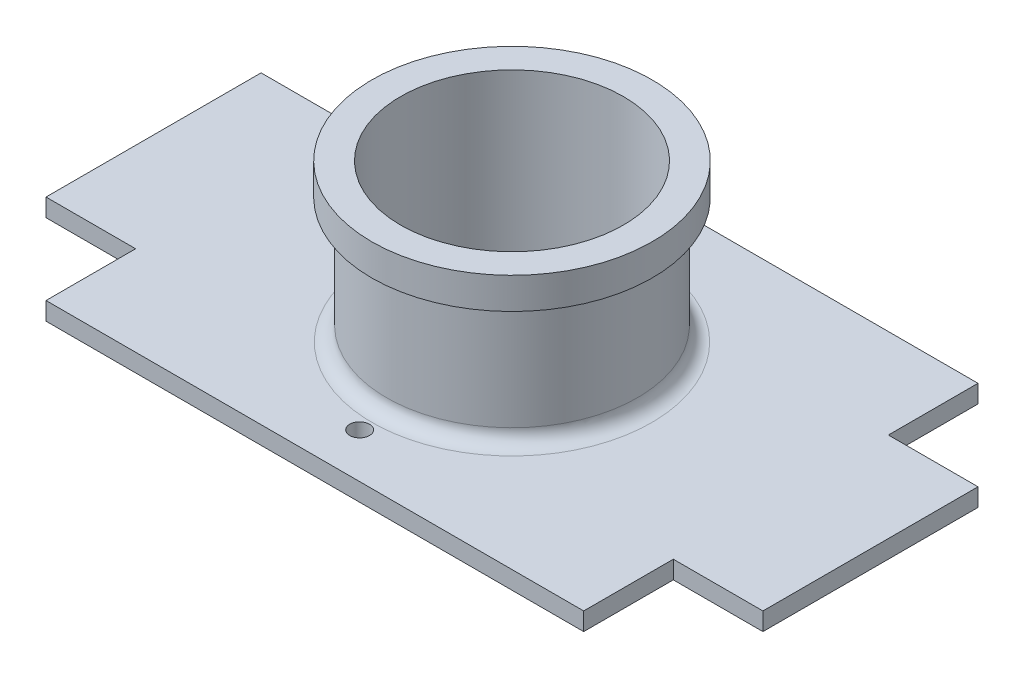
ISO-10303-21;
HEADER;
FILE_DESCRIPTION(('STEP AP214'),'2;1');
FILE_NAME('part.step','',(''),(''),'','','');
FILE_SCHEMA(('AUTOMOTIVE_DESIGN { 1 0 10303 214 1 1 1 1 }'));
ENDSEC;
DATA;
#1=APPLICATION_CONTEXT('core data for automotive mechanical design processes');
#2=APPLICATION_PROTOCOL_DEFINITION('international standard','automotive_design',2000,#1);
#3=PRODUCT_CONTEXT('',#1,'mechanical');
#4=PRODUCT('Part','Part','',(#3));
#5=PRODUCT_RELATED_PRODUCT_CATEGORY('part','',(#4));
#6=PRODUCT_DEFINITION_FORMATION('','',#4);
#7=PRODUCT_DEFINITION_CONTEXT('part definition',#1,'design');
#8=PRODUCT_DEFINITION('design','',#6,#7);
#9=PRODUCT_DEFINITION_SHAPE('','',#8);
#10=(LENGTH_UNIT() NAMED_UNIT(*) SI_UNIT(.MILLI.,.METRE.));
#11=(NAMED_UNIT(*) PLANE_ANGLE_UNIT() SI_UNIT($,.RADIAN.));
#12=(NAMED_UNIT(*) SI_UNIT($,.STERADIAN.) SOLID_ANGLE_UNIT());
#13=UNCERTAINTY_MEASURE_WITH_UNIT(LENGTH_MEASURE(1.E-05),#10,'distance_accuracy_value','');
#14=(GEOMETRIC_REPRESENTATION_CONTEXT(3) GLOBAL_UNCERTAINTY_ASSIGNED_CONTEXT((#13)) GLOBAL_UNIT_ASSIGNED_CONTEXT((#10,
#11,#12)) REPRESENTATION_CONTEXT('',''));
#15=CARTESIAN_POINT('',(0.,0.,0.));
#16=DIRECTION('',(0.,0.,1.));
#17=DIRECTION('',(1.,0.,0.));
#18=AXIS2_PLACEMENT_3D('',#15,#16,#17);
#19=CARTESIAN_POINT('',(0.,9.,0.));
#20=DIRECTION('',(0.,-1.,0.));
#21=DIRECTION('',(0.,0.,-1.));
#22=AXIS2_PLACEMENT_3D('',#19,#20,#21);
#23=CYLINDRICAL_SURFACE('',#22,31.0832015946794);
#24=CARTESIAN_POINT('',(0.,-40.,0.));
#25=DIRECTION('',(0.,1.,0.));
#26=DIRECTION('',(0.,0.,1.));
#27=AXIS2_PLACEMENT_3D('',#24,#25,#26);
#28=CIRCLE('',#27,31.0832015946794);
#29=CARTESIAN_POINT('',(0.,-40.,31.0832015946794));
#30=VERTEX_POINT('',#29);
#31=EDGE_CURVE('E221',#30,#30,#28,.T.);
#32=ORIENTED_EDGE('',*,*,#31,.F.);
#33=EDGE_LOOP('',(#32));
#34=FACE_BOUND('',#33,.T.);
#35=CARTESIAN_POINT('',(0.,8.75,0.));
#36=DIRECTION('',(0.,1.,0.));
#37=DIRECTION('',(0.,0.,1.));
#38=AXIS2_PLACEMENT_3D('',#35,#36,#37);
#39=CIRCLE('',#38,31.0832015946794);
#40=CARTESIAN_POINT('',(0.,8.75,31.0832015946794));
#41=VERTEX_POINT('',#40);
#42=EDGE_CURVE('E257',#41,#41,#39,.T.);
#43=ORIENTED_EDGE('',*,*,#42,.T.);
#44=EDGE_LOOP('',(#43));
#45=FACE_BOUND('',#44,.T.);
#46=ADVANCED_FACE('F43',(#34,#45),#23,.F.);
#47=CARTESIAN_POINT('',(0.,-40.,0.));
#48=DIRECTION('',(0.,1.,0.));
#49=DIRECTION('',(0.,0.,1.));
#50=AXIS2_PLACEMENT_3D('',#47,#48,#49);
#51=CYLINDRICAL_SURFACE('',#50,35.);
#52=CARTESIAN_POINT('',(0.,-31.,0.));
#53=DIRECTION('',(0.,-1.,0.));
#54=DIRECTION('',(0.,0.,-1.));
#55=AXIS2_PLACEMENT_3D('',#52,#53,#54);
#56=CIRCLE('',#55,35.);
#57=CARTESIAN_POINT('',(0.,-31.,-35.));
#58=VERTEX_POINT('',#57);
#59=EDGE_CURVE('E11',#58,#58,#56,.F.);
#60=ORIENTED_EDGE('',*,*,#59,.T.);
#61=EDGE_LOOP('',(#60));
#62=FACE_BOUND('',#61,.T.);
#63=CARTESIAN_POINT('',(0.,0.,0.));
#64=DIRECTION('',(0.,-1.,0.));
#65=DIRECTION('',(0.,0.,-1.));
#66=AXIS2_PLACEMENT_3D('',#63,#64,#65);
#67=CIRCLE('',#66,35.);
#68=CARTESIAN_POINT('',(0.,0.,-35.));
#69=VERTEX_POINT('',#68);
#70=EDGE_CURVE('E269',#69,#69,#67,.T.);
#71=ORIENTED_EDGE('',*,*,#70,.T.);
#72=EDGE_LOOP('',(#71));
#73=FACE_BOUND('',#72,.T.);
#74=ADVANCED_FACE('F299',(#62,#73),#51,.T.);
#75=CARTESIAN_POINT('',(0.,8.75,0.));
#76=DIRECTION('',(0.,-1.,0.));
#77=DIRECTION('',(0.,0.,-1.));
#78=AXIS2_PLACEMENT_3D('',#75,#76,#77);
#79=CYLINDRICAL_SURFACE('',#78,39.125);
#80=CARTESIAN_POINT('',(0.,8.75,0.));
#81=DIRECTION('',(0.,1.,0.));
#82=DIRECTION('',(0.,0.,1.));
#83=AXIS2_PLACEMENT_3D('',#80,#81,#82);
#84=CIRCLE('',#83,39.125);
#85=CARTESIAN_POINT('',(0.,8.75,39.125));
#86=VERTEX_POINT('',#85);
#87=EDGE_CURVE('E273',#86,#86,#84,.T.);
#88=ORIENTED_EDGE('',*,*,#87,.F.);
#89=EDGE_LOOP('',(#88));
#90=FACE_BOUND('',#89,.T.);
#91=CARTESIAN_POINT('',(0.,0.,0.));
#92=DIRECTION('',(0.,1.,0.));
#93=DIRECTION('',(0.,0.,1.));
#94=AXIS2_PLACEMENT_3D('',#91,#92,#93);
#95=CIRCLE('',#94,39.125);
#96=CARTESIAN_POINT('',(0.,0.,39.125));
#97=VERTEX_POINT('',#96);
#98=EDGE_CURVE('E277',#97,#97,#95,.T.);
#99=ORIENTED_EDGE('',*,*,#98,.T.);
#100=EDGE_LOOP('',(#99));
#101=FACE_BOUND('',#100,.T.);
#102=ADVANCED_FACE('F307',(#90,#101),#79,.T.);
#103=CARTESIAN_POINT('',(0.,8.75,0.));
#104=DIRECTION('',(0.,1.,0.));
#105=DIRECTION('',(0.,0.,1.));
#106=AXIS2_PLACEMENT_3D('',#103,#104,#105);
#107=PLANE('',#106);
#108=ORIENTED_EDGE('',*,*,#42,.F.);
#109=EDGE_LOOP('',(#108));
#110=FACE_BOUND('',#109,.T.);
#111=ORIENTED_EDGE('',*,*,#87,.T.);
#112=EDGE_LOOP('',(#111));
#113=FACE_BOUND('',#112,.T.);
#114=ADVANCED_FACE('F314',(#110,#113),#107,.T.);
#115=CARTESIAN_POINT('',(0.,0.,0.));
#116=DIRECTION('',(0.,1.,0.));
#117=DIRECTION('',(0.,0.,1.));
#118=AXIS2_PLACEMENT_3D('',#115,#116,#117);
#119=PLANE('',#118);
#120=ORIENTED_EDGE('',*,*,#70,.F.);
#121=EDGE_LOOP('',(#120));
#122=FACE_BOUND('',#121,.T.);
#123=ORIENTED_EDGE('',*,*,#98,.F.);
#124=EDGE_LOOP('',(#123));
#125=FACE_BOUND('',#124,.T.);
#126=ADVANCED_FACE('F317',(#122,#125),#119,.F.);
#127=CARTESIAN_POINT('',(0.,-35.,0.));
#128=DIRECTION('',(0.,-1.,0.));
#129=DIRECTION('',(0.,0.,-1.));
#130=AXIS2_PLACEMENT_3D('',#127,#128,#129);
#131=PLANE('',#130);
#132=CARTESIAN_POINT('',(0.,-35.,0.));
#133=DIRECTION('',(0.,-1.,0.));
#134=DIRECTION('',(0.,0.,-1.));
#135=AXIS2_PLACEMENT_3D('',#132,#133,#134);
#136=CIRCLE('',#135,39.);
#137=CARTESIAN_POINT('',(0.,-35.,-39.));
#138=VERTEX_POINT('',#137);
#139=EDGE_CURVE('E53',#138,#138,#136,.T.);
#140=ORIENTED_EDGE('',*,*,#139,.T.);
#141=EDGE_LOOP('',(#140));
#142=FACE_BOUND('',#141,.T.);
#143=CARTESIAN_POINT('',(0.,-35.,-42.5));
#144=DIRECTION('',(0.,1.,0.));
#145=DIRECTION('',(0.,0.,1.));
#146=AXIS2_PLACEMENT_3D('',#143,#144,#145);
#147=CIRCLE('',#146,2.75);
#148=CARTESIAN_POINT('',(0.,-35.,-39.75));
#149=VERTEX_POINT('',#148);
#150=EDGE_CURVE('E258',#149,#149,#147,.T.);
#151=ORIENTED_EDGE('',*,*,#150,.F.);
#152=EDGE_LOOP('',(#151));
#153=FACE_BOUND('',#152,.T.);
#154=CARTESIAN_POINT('',(2.40023105489521E-12,-35.,42.5));
#155=DIRECTION('',(0.,1.,0.));
#156=DIRECTION('',(0.,0.,1.));
#157=AXIS2_PLACEMENT_3D('',#154,#155,#156);
#158=CIRCLE('',#157,2.75000000000258);
#159=CARTESIAN_POINT('',(2.40023105489521E-12,-35.,45.2500000000026));
#160=VERTEX_POINT('',#159);
#161=EDGE_CURVE('E262',#160,#160,#158,.T.);
#162=ORIENTED_EDGE('',*,*,#161,.F.);
#163=EDGE_LOOP('',(#162));
#164=FACE_BOUND('',#163,.T.);
#165=DIRECTION('',(0.,0.,1.));
#166=VECTOR('',#165,1.);
#167=CARTESIAN_POINT('',(75.,-35.,-30.));
#168=LINE('',#167,#166);
#169=CARTESIAN_POINT('',(75.,-35.,-55.));
#170=VERTEX_POINT('',#169);
#171=CARTESIAN_POINT('',(75.,-35.,-30.));
#172=VERTEX_POINT('',#171);
#173=EDGE_CURVE('E218',#170,#172,#168,.T.);
#174=ORIENTED_EDGE('',*,*,#173,.F.);
#175=DIRECTION('',(1.,0.,0.));
#176=VECTOR('',#175,1.);
#177=CARTESIAN_POINT('',(-75.,-35.,-55.));
#178=LINE('',#177,#176);
#179=CARTESIAN_POINT('',(-75.,-35.,-55.));
#180=VERTEX_POINT('',#179);
#181=EDGE_CURVE('E159',#180,#170,#178,.T.);
#182=ORIENTED_EDGE('',*,*,#181,.F.);
#183=DIRECTION('',(0.,0.,-1.));
#184=VECTOR('',#183,1.);
#185=CARTESIAN_POINT('',(-75.,-35.,-30.));
#186=LINE('',#185,#184);
#187=CARTESIAN_POINT('',(-75.,-35.,-30.));
#188=VERTEX_POINT('',#187);
#189=EDGE_CURVE('E143',#188,#180,#186,.T.);
#190=ORIENTED_EDGE('',*,*,#189,.F.);
#191=DIRECTION('',(1.,0.,0.));
#192=VECTOR('',#191,1.);
#193=CARTESIAN_POINT('',(-75.,-35.,-30.));
#194=LINE('',#193,#192);
#195=CARTESIAN_POINT('',(-100.,-35.,-30.));
#196=VERTEX_POINT('',#195);
#197=EDGE_CURVE('E157',#196,#188,#194,.T.);
#198=ORIENTED_EDGE('',*,*,#197,.F.);
#199=DIRECTION('',(0.,0.,-1.));
#200=VECTOR('',#199,1.);
#201=CARTESIAN_POINT('',(-100.,-35.,30.));
#202=LINE('',#201,#200);
#203=CARTESIAN_POINT('',(-100.,-35.,30.));
#204=VERTEX_POINT('',#203);
#205=EDGE_CURVE('E164',#204,#196,#202,.T.);
#206=ORIENTED_EDGE('',*,*,#205,.F.);
#207=DIRECTION('',(-1.,0.,0.));
#208=VECTOR('',#207,1.);
#209=CARTESIAN_POINT('',(-75.,-35.,30.));
#210=LINE('',#209,#208);
#211=CARTESIAN_POINT('',(-75.,-35.,30.));
#212=VERTEX_POINT('',#211);
#213=EDGE_CURVE('E167',#212,#204,#210,.T.);
#214=ORIENTED_EDGE('',*,*,#213,.F.);
#215=DIRECTION('',(0.,0.,-1.));
#216=VECTOR('',#215,1.);
#217=CARTESIAN_POINT('',(-75.,-35.,55.));
#218=LINE('',#217,#216);
#219=CARTESIAN_POINT('',(-75.,-35.,55.));
#220=VERTEX_POINT('',#219);
#221=EDGE_CURVE('E589',#220,#212,#218,.T.);
#222=ORIENTED_EDGE('',*,*,#221,.F.);
#223=DIRECTION('',(-1.,0.,0.));
#224=VECTOR('',#223,1.);
#225=CARTESIAN_POINT('',(-75.,-35.,55.));
#226=LINE('',#225,#224);
#227=CARTESIAN_POINT('',(75.,-35.,55.));
#228=VERTEX_POINT('',#227);
#229=EDGE_CURVE('E585',#228,#220,#226,.T.);
#230=ORIENTED_EDGE('',*,*,#229,.F.);
#231=DIRECTION('',(0.,0.,1.));
#232=VECTOR('',#231,1.);
#233=CARTESIAN_POINT('',(75.,-35.,55.));
#234=LINE('',#233,#232);
#235=CARTESIAN_POINT('',(75.,-35.,30.));
#236=VERTEX_POINT('',#235);
#237=EDGE_CURVE('E581',#236,#228,#234,.T.);
#238=ORIENTED_EDGE('',*,*,#237,.F.);
#239=DIRECTION('',(-1.,0.,0.));
#240=VECTOR('',#239,1.);
#241=CARTESIAN_POINT('',(75.,-35.,30.));
#242=LINE('',#241,#240);
#243=CARTESIAN_POINT('',(100.,-35.,30.));
#244=VERTEX_POINT('',#243);
#245=EDGE_CURVE('E574',#244,#236,#242,.T.);
#246=ORIENTED_EDGE('',*,*,#245,.F.);
#247=DIRECTION('',(0.,0.,1.));
#248=VECTOR('',#247,1.);
#249=CARTESIAN_POINT('',(100.,-35.,30.));
#250=LINE('',#249,#248);
#251=CARTESIAN_POINT('',(100.,-35.,-30.));
#252=VERTEX_POINT('',#251);
#253=EDGE_CURVE('E570',#252,#244,#250,.T.);
#254=ORIENTED_EDGE('',*,*,#253,.F.);
#255=DIRECTION('',(1.,0.,0.));
#256=VECTOR('',#255,1.);
#257=CARTESIAN_POINT('',(75.,-35.,-30.));
#258=LINE('',#257,#256);
#259=EDGE_CURVE('E568',#172,#252,#258,.T.);
#260=ORIENTED_EDGE('',*,*,#259,.F.);
#261=EDGE_LOOP('',(#174,#182,#190,#198,#206,#214,#222,#230,#238,#246,#254,#260));
#262=FACE_BOUND('',#261,.T.);
#263=ADVANCED_FACE('F155',(#142,#153,#164,#262),#131,.F.);
#264=CARTESIAN_POINT('',(0.,-40.,0.));
#265=DIRECTION('',(0.,-1.,0.));
#266=DIRECTION('',(0.,0.,-1.));
#267=AXIS2_PLACEMENT_3D('',#264,#265,#266);
#268=PLANE('',#267);
#269=ORIENTED_EDGE('',*,*,#31,.T.);
#270=EDGE_LOOP('',(#269));
#271=FACE_BOUND('',#270,.T.);
#272=CARTESIAN_POINT('',(0.,-40.,-42.5));
#273=DIRECTION('',(0.,1.,0.));
#274=DIRECTION('',(0.,0.,1.));
#275=AXIS2_PLACEMENT_3D('',#272,#273,#274);
#276=CIRCLE('',#275,2.75);
#277=CARTESIAN_POINT('',(0.,-40.,-39.75));
#278=VERTEX_POINT('',#277);
#279=EDGE_CURVE('E253',#278,#278,#276,.T.);
#280=ORIENTED_EDGE('',*,*,#279,.T.);
#281=EDGE_LOOP('',(#280));
#282=FACE_BOUND('',#281,.T.);
#283=CARTESIAN_POINT('',(2.40023105489521E-12,-40.,42.5));
#284=DIRECTION('',(0.,1.,0.));
#285=DIRECTION('',(0.,0.,1.));
#286=AXIS2_PLACEMENT_3D('',#283,#284,#285);
#287=CIRCLE('',#286,2.75000000000258);
#288=CARTESIAN_POINT('',(2.40023105489521E-12,-40.,45.2500000000026));
#289=VERTEX_POINT('',#288);
#290=EDGE_CURVE('E252',#289,#289,#287,.T.);
#291=ORIENTED_EDGE('',*,*,#290,.T.);
#292=EDGE_LOOP('',(#291));
#293=FACE_BOUND('',#292,.T.);
#294=DIRECTION('',(0.,0.,1.));
#295=VECTOR('',#294,1.);
#296=CARTESIAN_POINT('',(75.,-40.,-30.));
#297=LINE('',#296,#295);
#298=CARTESIAN_POINT('',(75.,-40.,-55.));
#299=VERTEX_POINT('',#298);
#300=CARTESIAN_POINT('',(75.,-40.,-30.));
#301=VERTEX_POINT('',#300);
#302=EDGE_CURVE('E173',#299,#301,#297,.T.);
#303=ORIENTED_EDGE('',*,*,#302,.T.);
#304=DIRECTION('',(1.,0.,0.));
#305=VECTOR('',#304,1.);
#306=CARTESIAN_POINT('',(75.,-40.,-30.));
#307=LINE('',#306,#305);
#308=CARTESIAN_POINT('',(100.,-40.,-30.));
#309=VERTEX_POINT('',#308);
#310=EDGE_CURVE('E177',#301,#309,#307,.T.);
#311=ORIENTED_EDGE('',*,*,#310,.T.);
#312=DIRECTION('',(0.,0.,1.));
#313=VECTOR('',#312,1.);
#314=CARTESIAN_POINT('',(100.,-40.,30.));
#315=LINE('',#314,#313);
#316=CARTESIAN_POINT('',(100.,-40.,30.));
#317=VERTEX_POINT('',#316);
#318=EDGE_CURVE('E181',#309,#317,#315,.T.);
#319=ORIENTED_EDGE('',*,*,#318,.T.);
#320=DIRECTION('',(-1.,0.,0.));
#321=VECTOR('',#320,1.);
#322=CARTESIAN_POINT('',(75.,-40.,30.));
#323=LINE('',#322,#321);
#324=CARTESIAN_POINT('',(75.,-40.,30.));
#325=VERTEX_POINT('',#324);
#326=EDGE_CURVE('E185',#317,#325,#323,.T.);
#327=ORIENTED_EDGE('',*,*,#326,.T.);
#328=DIRECTION('',(0.,0.,1.));
#329=VECTOR('',#328,1.);
#330=CARTESIAN_POINT('',(75.,-40.,55.));
#331=LINE('',#330,#329);
#332=CARTESIAN_POINT('',(75.,-40.,55.));
#333=VERTEX_POINT('',#332);
#334=EDGE_CURVE('E189',#325,#333,#331,.T.);
#335=ORIENTED_EDGE('',*,*,#334,.T.);
#336=DIRECTION('',(-1.,0.,0.));
#337=VECTOR('',#336,1.);
#338=CARTESIAN_POINT('',(-75.,-40.,55.));
#339=LINE('',#338,#337);
#340=CARTESIAN_POINT('',(-75.,-40.,55.));
#341=VERTEX_POINT('',#340);
#342=EDGE_CURVE('E193',#333,#341,#339,.T.);
#343=ORIENTED_EDGE('',*,*,#342,.T.);
#344=DIRECTION('',(0.,0.,-1.));
#345=VECTOR('',#344,1.);
#346=CARTESIAN_POINT('',(-75.,-40.,55.));
#347=LINE('',#346,#345);
#348=CARTESIAN_POINT('',(-75.,-40.,30.));
#349=VERTEX_POINT('',#348);
#350=EDGE_CURVE('E197',#341,#349,#347,.T.);
#351=ORIENTED_EDGE('',*,*,#350,.T.);
#352=DIRECTION('',(-1.,0.,0.));
#353=VECTOR('',#352,1.);
#354=CARTESIAN_POINT('',(-75.,-40.,30.));
#355=LINE('',#354,#353);
#356=CARTESIAN_POINT('',(-100.,-40.,30.));
#357=VERTEX_POINT('',#356);
#358=EDGE_CURVE('E201',#349,#357,#355,.T.);
#359=ORIENTED_EDGE('',*,*,#358,.T.);
#360=DIRECTION('',(0.,0.,-1.));
#361=VECTOR('',#360,1.);
#362=CARTESIAN_POINT('',(-100.,-40.,30.));
#363=LINE('',#362,#361);
#364=CARTESIAN_POINT('',(-100.,-40.,-30.));
#365=VERTEX_POINT('',#364);
#366=EDGE_CURVE('E205',#357,#365,#363,.T.);
#367=ORIENTED_EDGE('',*,*,#366,.T.);
#368=DIRECTION('',(1.,0.,0.));
#369=VECTOR('',#368,1.);
#370=CARTESIAN_POINT('',(-75.,-40.,-30.));
#371=LINE('',#370,#369);
#372=CARTESIAN_POINT('',(-75.,-40.,-30.));
#373=VERTEX_POINT('',#372);
#374=EDGE_CURVE('E209',#365,#373,#371,.T.);
#375=ORIENTED_EDGE('',*,*,#374,.T.);
#376=DIRECTION('',(0.,0.,-1.));
#377=VECTOR('',#376,1.);
#378=CARTESIAN_POINT('',(-75.,-40.,-30.));
#379=LINE('',#378,#377);
#380=CARTESIAN_POINT('',(-75.,-40.,-55.));
#381=VERTEX_POINT('',#380);
#382=EDGE_CURVE('E145',#373,#381,#379,.T.);
#383=ORIENTED_EDGE('',*,*,#382,.T.);
#384=DIRECTION('',(1.,0.,0.));
#385=VECTOR('',#384,1.);
#386=CARTESIAN_POINT('',(-75.,-40.,-55.));
#387=LINE('',#386,#385);
#388=EDGE_CURVE('E214',#381,#299,#387,.T.);
#389=ORIENTED_EDGE('',*,*,#388,.T.);
#390=EDGE_LOOP('',(#303,#311,#319,#327,#335,#343,#351,#359,#367,#375,#383,#389));
#391=FACE_BOUND('',#390,.T.);
#392=ADVANCED_FACE('F349',(#271,#282,#293,#391),#268,.T.);
#393=CARTESIAN_POINT('',(2.40023105489521E-12,-40.,42.5));
#394=DIRECTION('',(0.,1.,0.));
#395=DIRECTION('',(0.,0.,1.));
#396=AXIS2_PLACEMENT_3D('',#393,#394,#395);
#397=CYLINDRICAL_SURFACE('',#396,2.75000000000258);
#398=ORIENTED_EDGE('',*,*,#290,.F.);
#399=EDGE_LOOP('',(#398));
#400=FACE_BOUND('',#399,.T.);
#401=ORIENTED_EDGE('',*,*,#161,.T.);
#402=EDGE_LOOP('',(#401));
#403=FACE_BOUND('',#402,.T.);
#404=ADVANCED_FACE('F345',(#400,#403),#397,.F.);
#405=CARTESIAN_POINT('',(0.,-40.,-42.5));
#406=DIRECTION('',(0.,1.,0.));
#407=DIRECTION('',(0.,0.,1.));
#408=AXIS2_PLACEMENT_3D('',#405,#406,#407);
#409=CYLINDRICAL_SURFACE('',#408,2.75);
#410=ORIENTED_EDGE('',*,*,#279,.F.);
#411=EDGE_LOOP('',(#410));
#412=FACE_BOUND('',#411,.T.);
#413=ORIENTED_EDGE('',*,*,#150,.T.);
#414=EDGE_LOOP('',(#413));
#415=FACE_BOUND('',#414,.T.);
#416=ADVANCED_FACE('F348',(#412,#415),#409,.F.);
#417=CARTESIAN_POINT('',(75.,-35.,-30.));
#418=DIRECTION('',(1.,0.,0.));
#419=DIRECTION('',(0.,0.,-1.));
#420=AXIS2_PLACEMENT_3D('',#417,#418,#419);
#421=PLANE('',#420);
#422=ORIENTED_EDGE('',*,*,#302,.F.);
#423=DIRECTION('',(0.,-1.,0.));
#424=VECTOR('',#423,1.);
#425=CARTESIAN_POINT('',(75.,-35.,-55.));
#426=LINE('',#425,#424);
#427=EDGE_CURVE('E61',#170,#299,#426,.T.);
#428=ORIENTED_EDGE('',*,*,#427,.F.);
#429=ORIENTED_EDGE('',*,*,#173,.T.);
#430=DIRECTION('',(0.,-1.,0.));
#431=VECTOR('',#430,1.);
#432=CARTESIAN_POINT('',(75.,-35.,-30.));
#433=LINE('',#432,#431);
#434=EDGE_CURVE('E114',#172,#301,#433,.T.);
#435=ORIENTED_EDGE('',*,*,#434,.T.);
#436=EDGE_LOOP('',(#422,#428,#429,#435));
#437=FACE_BOUND('',#436,.T.);
#438=ADVANCED_FACE('F356',(#437),#421,.T.);
#439=CARTESIAN_POINT('',(-75.,-35.,-55.));
#440=DIRECTION('',(0.,0.,-1.));
#441=DIRECTION('',(-1.,0.,0.));
#442=AXIS2_PLACEMENT_3D('',#439,#440,#441);
#443=PLANE('',#442);
#444=ORIENTED_EDGE('',*,*,#388,.F.);
#445=DIRECTION('',(0.,-1.,0.));
#446=VECTOR('',#445,1.);
#447=CARTESIAN_POINT('',(-75.,-35.,-55.));
#448=LINE('',#447,#446);
#449=EDGE_CURVE('E102',#180,#381,#448,.T.);
#450=ORIENTED_EDGE('',*,*,#449,.F.);
#451=ORIENTED_EDGE('',*,*,#181,.T.);
#452=ORIENTED_EDGE('',*,*,#427,.T.);
#453=EDGE_LOOP('',(#444,#450,#451,#452));
#454=FACE_BOUND('',#453,.T.);
#455=ADVANCED_FACE('F375',(#454),#443,.T.);
#456=CARTESIAN_POINT('',(-75.,-35.,-30.));
#457=DIRECTION('',(-1.,0.,0.));
#458=DIRECTION('',(0.,0.,1.));
#459=AXIS2_PLACEMENT_3D('',#456,#457,#458);
#460=PLANE('',#459);
#461=ORIENTED_EDGE('',*,*,#382,.F.);
#462=DIRECTION('',(0.,-1.,0.));
#463=VECTOR('',#462,1.);
#464=CARTESIAN_POINT('',(-75.,-35.,-30.));
#465=LINE('',#464,#463);
#466=EDGE_CURVE('E140',#188,#373,#465,.T.);
#467=ORIENTED_EDGE('',*,*,#466,.F.);
#468=ORIENTED_EDGE('',*,*,#189,.T.);
#469=ORIENTED_EDGE('',*,*,#449,.T.);
#470=EDGE_LOOP('',(#461,#467,#468,#469));
#471=FACE_BOUND('',#470,.T.);
#472=ADVANCED_FACE('F142',(#471),#460,.T.);
#473=CARTESIAN_POINT('',(-75.,-35.,-30.));
#474=DIRECTION('',(0.,0.,-1.));
#475=DIRECTION('',(-1.,0.,0.));
#476=AXIS2_PLACEMENT_3D('',#473,#474,#475);
#477=PLANE('',#476);
#478=ORIENTED_EDGE('',*,*,#374,.F.);
#479=DIRECTION('',(0.,-1.,0.));
#480=VECTOR('',#479,1.);
#481=CARTESIAN_POINT('',(-100.,-35.,-30.));
#482=LINE('',#481,#480);
#483=EDGE_CURVE('E151',#196,#365,#482,.T.);
#484=ORIENTED_EDGE('',*,*,#483,.F.);
#485=ORIENTED_EDGE('',*,*,#197,.T.);
#486=ORIENTED_EDGE('',*,*,#466,.T.);
#487=EDGE_LOOP('',(#478,#484,#485,#486));
#488=FACE_BOUND('',#487,.T.);
#489=ADVANCED_FACE('F162',(#488),#477,.T.);
#490=CARTESIAN_POINT('',(-100.,-35.,30.));
#491=DIRECTION('',(-1.,0.,0.));
#492=DIRECTION('',(0.,0.,1.));
#493=AXIS2_PLACEMENT_3D('',#490,#491,#492);
#494=PLANE('',#493);
#495=ORIENTED_EDGE('',*,*,#366,.F.);
#496=DIRECTION('',(0.,-1.,0.));
#497=VECTOR('',#496,1.);
#498=CARTESIAN_POINT('',(-100.,-35.,30.));
#499=LINE('',#498,#497);
#500=EDGE_CURVE('E226',#204,#357,#499,.T.);
#501=ORIENTED_EDGE('',*,*,#500,.F.);
#502=ORIENTED_EDGE('',*,*,#205,.T.);
#503=ORIENTED_EDGE('',*,*,#483,.T.);
#504=EDGE_LOOP('',(#495,#501,#502,#503));
#505=FACE_BOUND('',#504,.T.);
#506=ADVANCED_FACE('F394',(#505),#494,.T.);
#507=CARTESIAN_POINT('',(-75.,-35.,30.));
#508=DIRECTION('',(0.,0.,1.));
#509=DIRECTION('',(1.,0.,0.));
#510=AXIS2_PLACEMENT_3D('',#507,#508,#509);
#511=PLANE('',#510);
#512=ORIENTED_EDGE('',*,*,#358,.F.);
#513=DIRECTION('',(0.,-1.,0.));
#514=VECTOR('',#513,1.);
#515=CARTESIAN_POINT('',(-75.,-35.,30.));
#516=LINE('',#515,#514);
#517=EDGE_CURVE('E229',#212,#349,#516,.T.);
#518=ORIENTED_EDGE('',*,*,#517,.F.);
#519=ORIENTED_EDGE('',*,*,#213,.T.);
#520=ORIENTED_EDGE('',*,*,#500,.T.);
#521=EDGE_LOOP('',(#512,#518,#519,#520));
#522=FACE_BOUND('',#521,.T.);
#523=ADVANCED_FACE('F401',(#522),#511,.T.);
#524=CARTESIAN_POINT('',(-75.,-35.,55.));
#525=DIRECTION('',(-1.,0.,0.));
#526=DIRECTION('',(0.,0.,1.));
#527=AXIS2_PLACEMENT_3D('',#524,#525,#526);
#528=PLANE('',#527);
#529=ORIENTED_EDGE('',*,*,#350,.F.);
#530=DIRECTION('',(0.,-1.,0.));
#531=VECTOR('',#530,1.);
#532=CARTESIAN_POINT('',(-75.,-35.,55.));
#533=LINE('',#532,#531);
#534=EDGE_CURVE('E232',#220,#341,#533,.T.);
#535=ORIENTED_EDGE('',*,*,#534,.F.);
#536=ORIENTED_EDGE('',*,*,#221,.T.);
#537=ORIENTED_EDGE('',*,*,#517,.T.);
#538=EDGE_LOOP('',(#529,#535,#536,#537));
#539=FACE_BOUND('',#538,.T.);
#540=ADVANCED_FACE('F409',(#539),#528,.T.);
#541=CARTESIAN_POINT('',(-75.,-35.,55.));
#542=DIRECTION('',(0.,0.,1.));
#543=DIRECTION('',(1.,0.,0.));
#544=AXIS2_PLACEMENT_3D('',#541,#542,#543);
#545=PLANE('',#544);
#546=ORIENTED_EDGE('',*,*,#342,.F.);
#547=DIRECTION('',(0.,-1.,0.));
#548=VECTOR('',#547,1.);
#549=CARTESIAN_POINT('',(75.,-35.,55.));
#550=LINE('',#549,#548);
#551=EDGE_CURVE('E235',#228,#333,#550,.T.);
#552=ORIENTED_EDGE('',*,*,#551,.F.);
#553=ORIENTED_EDGE('',*,*,#229,.T.);
#554=ORIENTED_EDGE('',*,*,#534,.T.);
#555=EDGE_LOOP('',(#546,#552,#553,#554));
#556=FACE_BOUND('',#555,.T.);
#557=ADVANCED_FACE('F417',(#556),#545,.T.);
#558=CARTESIAN_POINT('',(75.,-35.,55.));
#559=DIRECTION('',(1.,0.,0.));
#560=DIRECTION('',(0.,0.,-1.));
#561=AXIS2_PLACEMENT_3D('',#558,#559,#560);
#562=PLANE('',#561);
#563=ORIENTED_EDGE('',*,*,#334,.F.);
#564=DIRECTION('',(0.,-1.,0.));
#565=VECTOR('',#564,1.);
#566=CARTESIAN_POINT('',(75.,-35.,30.));
#567=LINE('',#566,#565);
#568=EDGE_CURVE('E238',#236,#325,#567,.T.);
#569=ORIENTED_EDGE('',*,*,#568,.F.);
#570=ORIENTED_EDGE('',*,*,#237,.T.);
#571=ORIENTED_EDGE('',*,*,#551,.T.);
#572=EDGE_LOOP('',(#563,#569,#570,#571));
#573=FACE_BOUND('',#572,.T.);
#574=ADVANCED_FACE('F425',(#573),#562,.T.);
#575=CARTESIAN_POINT('',(75.,-35.,30.));
#576=DIRECTION('',(0.,0.,1.));
#577=DIRECTION('',(1.,0.,0.));
#578=AXIS2_PLACEMENT_3D('',#575,#576,#577);
#579=PLANE('',#578);
#580=ORIENTED_EDGE('',*,*,#326,.F.);
#581=DIRECTION('',(0.,-1.,0.));
#582=VECTOR('',#581,1.);
#583=CARTESIAN_POINT('',(100.,-35.,30.));
#584=LINE('',#583,#582);
#585=EDGE_CURVE('E241',#244,#317,#584,.T.);
#586=ORIENTED_EDGE('',*,*,#585,.F.);
#587=ORIENTED_EDGE('',*,*,#245,.T.);
#588=ORIENTED_EDGE('',*,*,#568,.T.);
#589=EDGE_LOOP('',(#580,#586,#587,#588));
#590=FACE_BOUND('',#589,.T.);
#591=ADVANCED_FACE('F433',(#590),#579,.T.);
#592=CARTESIAN_POINT('',(100.,-35.,30.));
#593=DIRECTION('',(1.,0.,0.));
#594=DIRECTION('',(0.,0.,-1.));
#595=AXIS2_PLACEMENT_3D('',#592,#593,#594);
#596=PLANE('',#595);
#597=ORIENTED_EDGE('',*,*,#318,.F.);
#598=DIRECTION('',(0.,-1.,0.));
#599=VECTOR('',#598,1.);
#600=CARTESIAN_POINT('',(100.,-35.,-30.));
#601=LINE('',#600,#599);
#602=EDGE_CURVE('E244',#252,#309,#601,.T.);
#603=ORIENTED_EDGE('',*,*,#602,.F.);
#604=ORIENTED_EDGE('',*,*,#253,.T.);
#605=ORIENTED_EDGE('',*,*,#585,.T.);
#606=EDGE_LOOP('',(#597,#603,#604,#605));
#607=FACE_BOUND('',#606,.T.);
#608=ADVANCED_FACE('F295',(#607),#596,.T.);
#609=CARTESIAN_POINT('',(75.,-35.,-30.));
#610=DIRECTION('',(0.,0.,-1.));
#611=DIRECTION('',(-1.,0.,0.));
#612=AXIS2_PLACEMENT_3D('',#609,#610,#611);
#613=PLANE('',#612);
#614=ORIENTED_EDGE('',*,*,#310,.F.);
#615=ORIENTED_EDGE('',*,*,#434,.F.);
#616=ORIENTED_EDGE('',*,*,#259,.T.);
#617=ORIENTED_EDGE('',*,*,#602,.T.);
#618=EDGE_LOOP('',(#614,#615,#616,#617));
#619=FACE_BOUND('',#618,.T.);
#620=ADVANCED_FACE('F290',(#619),#613,.T.);
#621=CARTESIAN_POINT('',(0.,-31.,0.));
#622=DIRECTION('',(0.,-1.,0.));
#623=DIRECTION('',(0.,0.,-1.));
#624=AXIS2_PLACEMENT_3D('',#621,#622,#623);
#625=TOROIDAL_SURFACE('',#624,39.,4.);
#626=ORIENTED_EDGE('',*,*,#59,.F.);
#627=EDGE_LOOP('',(#626));
#628=FACE_BOUND('',#627,.T.);
#629=ORIENTED_EDGE('',*,*,#139,.F.);
#630=EDGE_LOOP('',(#629));
#631=FACE_BOUND('',#630,.T.);
#632=ADVANCED_FACE('F45',(#628,#631),#625,.F.);
#633=CLOSED_SHELL('',(#46,#74,#102,#114,#126,#263,#392,#404,#416,#438,#455,#472,#489,#506,#523,
#540,#557,#574,#591,#608,#620,#632));
#634=MANIFOLD_SOLID_BREP('B2',#633);
#635=ADVANCED_BREP_SHAPE_REPRESENTATION('',(#18,#634),#14);
#636=SHAPE_DEFINITION_REPRESENTATION(#9,#635);
ENDSEC;
END-ISO-10303-21;
